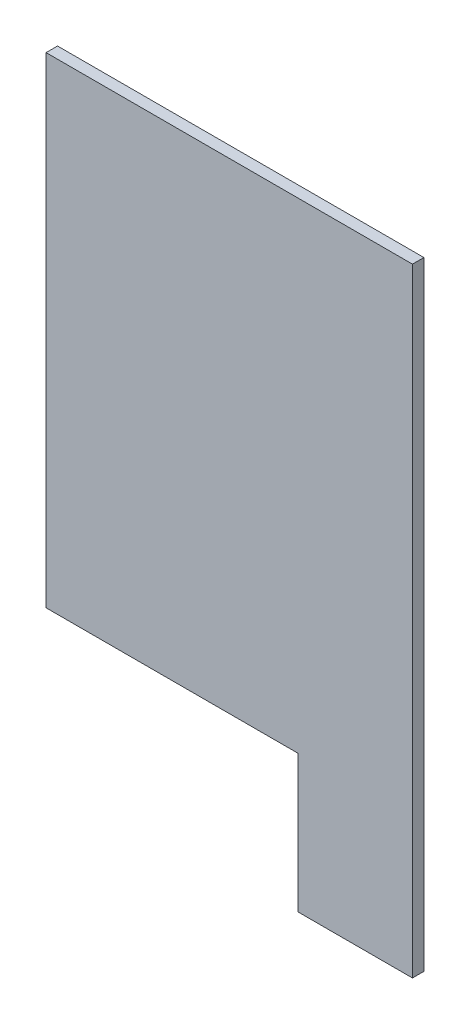
ISO-10303-21;
HEADER;
FILE_DESCRIPTION(('STEP AP214'),'2;1');
FILE_NAME('part.step','',(''),(''),'','','');
FILE_SCHEMA(('AUTOMOTIVE_DESIGN { 1 0 10303 214 1 1 1 1 }'));
ENDSEC;
DATA;
#1=APPLICATION_CONTEXT('core data for automotive mechanical design processes');
#2=APPLICATION_PROTOCOL_DEFINITION('international standard','automotive_design',2000,#1);
#3=PRODUCT_CONTEXT('',#1,'mechanical');
#4=PRODUCT('Part','Part','',(#3));
#5=PRODUCT_RELATED_PRODUCT_CATEGORY('part','',(#4));
#6=PRODUCT_DEFINITION_FORMATION('','',#4);
#7=PRODUCT_DEFINITION_CONTEXT('part definition',#1,'design');
#8=PRODUCT_DEFINITION('design','',#6,#7);
#9=PRODUCT_DEFINITION_SHAPE('','',#8);
#10=(LENGTH_UNIT() NAMED_UNIT(*) SI_UNIT(.MILLI.,.METRE.));
#11=(NAMED_UNIT(*) PLANE_ANGLE_UNIT() SI_UNIT($,.RADIAN.));
#12=(NAMED_UNIT(*) SI_UNIT($,.STERADIAN.) SOLID_ANGLE_UNIT());
#13=UNCERTAINTY_MEASURE_WITH_UNIT(LENGTH_MEASURE(1.E-05),#10,'distance_accuracy_value','');
#14=(GEOMETRIC_REPRESENTATION_CONTEXT(3) GLOBAL_UNCERTAINTY_ASSIGNED_CONTEXT((#13)) GLOBAL_UNIT_ASSIGNED_CONTEXT((#10,
#11,#12)) REPRESENTATION_CONTEXT('',''));
#15=CARTESIAN_POINT('',(0.,0.,0.));
#16=DIRECTION('',(0.,0.,1.));
#17=DIRECTION('',(1.,0.,0.));
#18=AXIS2_PLACEMENT_3D('',#15,#16,#17);
#19=CARTESIAN_POINT('',(0.,0.,5.));
#20=DIRECTION('',(1.,0.,0.));
#21=DIRECTION('',(0.,1.,0.));
#22=AXIS2_PLACEMENT_3D('',#19,#20,#21);
#23=PLANE('',#22);
#24=DIRECTION('',(0.,-1.,0.));
#25=VECTOR('',#24,1.);
#26=CARTESIAN_POINT('',(0.,0.,0.));
#27=LINE('',#26,#25);
#28=CARTESIAN_POINT('',(0.,0.,0.));
#29=VERTEX_POINT('',#28);
#30=CARTESIAN_POINT('',(0.,-210.,0.));
#31=VERTEX_POINT('',#30);
#32=EDGE_CURVE('E128',#29,#31,#27,.T.);
#33=ORIENTED_EDGE('',*,*,#32,.T.);
#34=DIRECTION('',(0.,0.,-1.));
#35=VECTOR('',#34,1.);
#36=CARTESIAN_POINT('',(0.,-210.,5.));
#37=LINE('',#36,#35);
#38=CARTESIAN_POINT('',(0.,-210.,5.));
#39=VERTEX_POINT('',#38);
#40=EDGE_CURVE('E11',#39,#31,#37,.T.);
#41=ORIENTED_EDGE('',*,*,#40,.F.);
#42=DIRECTION('',(0.,-1.,0.));
#43=VECTOR('',#42,1.);
#44=CARTESIAN_POINT('',(0.,0.,5.));
#45=LINE('',#44,#43);
#46=CARTESIAN_POINT('',(0.,0.,5.));
#47=VERTEX_POINT('',#46);
#48=EDGE_CURVE('E144',#47,#39,#45,.T.);
#49=ORIENTED_EDGE('',*,*,#48,.F.);
#50=DIRECTION('',(0.,0.,-1.));
#51=VECTOR('',#50,1.);
#52=CARTESIAN_POINT('',(0.,0.,5.));
#53=LINE('',#52,#51);
#54=EDGE_CURVE('E124',#47,#29,#53,.T.);
#55=ORIENTED_EDGE('',*,*,#54,.T.);
#56=EDGE_LOOP('',(#33,#41,#49,#55));
#57=FACE_BOUND('',#56,.T.);
#58=ADVANCED_FACE('F39',(#57),#23,.F.);
#59=CARTESIAN_POINT('',(0.,-210.,5.));
#60=DIRECTION('',(0.,1.,0.));
#61=DIRECTION('',(0.,0.,1.));
#62=AXIS2_PLACEMENT_3D('',#59,#60,#61);
#63=PLANE('',#62);
#64=DIRECTION('',(1.,0.,0.));
#65=VECTOR('',#64,1.);
#66=CARTESIAN_POINT('',(0.,-210.,0.));
#67=LINE('',#66,#65);
#68=CARTESIAN_POINT('',(110.,-210.,0.));
#69=VERTEX_POINT('',#68);
#70=EDGE_CURVE('E132',#31,#69,#67,.T.);
#71=ORIENTED_EDGE('',*,*,#70,.T.);
#72=DIRECTION('',(0.,0.,-1.));
#73=VECTOR('',#72,1.);
#74=CARTESIAN_POINT('',(110.,-210.,5.));
#75=LINE('',#74,#73);
#76=CARTESIAN_POINT('',(110.,-210.,5.));
#77=VERTEX_POINT('',#76);
#78=EDGE_CURVE('E48',#77,#69,#75,.T.);
#79=ORIENTED_EDGE('',*,*,#78,.F.);
#80=DIRECTION('',(1.,0.,0.));
#81=VECTOR('',#80,1.);
#82=CARTESIAN_POINT('',(0.,-210.,5.));
#83=LINE('',#82,#81);
#84=EDGE_CURVE('E93',#39,#77,#83,.T.);
#85=ORIENTED_EDGE('',*,*,#84,.F.);
#86=ORIENTED_EDGE('',*,*,#40,.T.);
#87=EDGE_LOOP('',(#71,#79,#85,#86));
#88=FACE_BOUND('',#87,.T.);
#89=ADVANCED_FACE('F172',(#88),#63,.F.);
#90=CARTESIAN_POINT('',(110.,-210.,5.));
#91=DIRECTION('',(1.,0.,0.));
#92=DIRECTION('',(0.,1.,0.));
#93=AXIS2_PLACEMENT_3D('',#90,#91,#92);
#94=PLANE('',#93);
#95=DIRECTION('',(0.,-1.,0.));
#96=VECTOR('',#95,1.);
#97=CARTESIAN_POINT('',(110.,-210.,0.));
#98=LINE('',#97,#96);
#99=CARTESIAN_POINT('',(110.,-270.,0.));
#100=VERTEX_POINT('',#99);
#101=EDGE_CURVE('E135',#69,#100,#98,.T.);
#102=ORIENTED_EDGE('',*,*,#101,.T.);
#103=DIRECTION('',(0.,0.,-1.));
#104=VECTOR('',#103,1.);
#105=CARTESIAN_POINT('',(110.,-270.,5.));
#106=LINE('',#105,#104);
#107=CARTESIAN_POINT('',(110.,-270.,5.));
#108=VERTEX_POINT('',#107);
#109=EDGE_CURVE('E117',#108,#100,#106,.T.);
#110=ORIENTED_EDGE('',*,*,#109,.F.);
#111=DIRECTION('',(0.,-1.,0.));
#112=VECTOR('',#111,1.);
#113=CARTESIAN_POINT('',(110.,-210.,5.));
#114=LINE('',#113,#112);
#115=EDGE_CURVE('E106',#77,#108,#114,.T.);
#116=ORIENTED_EDGE('',*,*,#115,.F.);
#117=ORIENTED_EDGE('',*,*,#78,.T.);
#118=EDGE_LOOP('',(#102,#110,#116,#117));
#119=FACE_BOUND('',#118,.T.);
#120=ADVANCED_FACE('F154',(#119),#94,.F.);
#121=CARTESIAN_POINT('',(110.,-270.,5.));
#122=DIRECTION('',(0.,1.,0.));
#123=DIRECTION('',(0.,0.,1.));
#124=AXIS2_PLACEMENT_3D('',#121,#122,#123);
#125=PLANE('',#124);
#126=DIRECTION('',(1.,0.,0.));
#127=VECTOR('',#126,1.);
#128=CARTESIAN_POINT('',(110.,-270.,0.));
#129=LINE('',#128,#127);
#130=CARTESIAN_POINT('',(160.,-270.,0.));
#131=VERTEX_POINT('',#130);
#132=EDGE_CURVE('E115',#100,#131,#129,.T.);
#133=ORIENTED_EDGE('',*,*,#132,.T.);
#134=DIRECTION('',(0.,0.,-1.));
#135=VECTOR('',#134,1.);
#136=CARTESIAN_POINT('',(160.,-270.,5.));
#137=LINE('',#136,#135);
#138=CARTESIAN_POINT('',(160.,-270.,5.));
#139=VERTEX_POINT('',#138);
#140=EDGE_CURVE('E112',#139,#131,#137,.T.);
#141=ORIENTED_EDGE('',*,*,#140,.F.);
#142=DIRECTION('',(1.,0.,0.));
#143=VECTOR('',#142,1.);
#144=CARTESIAN_POINT('',(110.,-270.,5.));
#145=LINE('',#144,#143);
#146=EDGE_CURVE('E100',#108,#139,#145,.T.);
#147=ORIENTED_EDGE('',*,*,#146,.F.);
#148=ORIENTED_EDGE('',*,*,#109,.T.);
#149=EDGE_LOOP('',(#133,#141,#147,#148));
#150=FACE_BOUND('',#149,.T.);
#151=ADVANCED_FACE('F113',(#150),#125,.F.);
#152=CARTESIAN_POINT('',(160.,0.,5.));
#153=DIRECTION('',(-1.,0.,0.));
#154=DIRECTION('',(0.,0.,1.));
#155=AXIS2_PLACEMENT_3D('',#152,#153,#154);
#156=PLANE('',#155);
#157=DIRECTION('',(0.,1.,0.));
#158=VECTOR('',#157,1.);
#159=CARTESIAN_POINT('',(160.,0.,0.));
#160=LINE('',#159,#158);
#161=CARTESIAN_POINT('',(160.,0.,0.));
#162=VERTEX_POINT('',#161);
#163=EDGE_CURVE('E79',#131,#162,#160,.T.);
#164=ORIENTED_EDGE('',*,*,#163,.T.);
#165=DIRECTION('',(0.,0.,-1.));
#166=VECTOR('',#165,1.);
#167=CARTESIAN_POINT('',(160.,0.,5.));
#168=LINE('',#167,#166);
#169=CARTESIAN_POINT('',(160.,0.,5.));
#170=VERTEX_POINT('',#169);
#171=EDGE_CURVE('E118',#170,#162,#168,.T.);
#172=ORIENTED_EDGE('',*,*,#171,.F.);
#173=DIRECTION('',(0.,1.,0.));
#174=VECTOR('',#173,1.);
#175=CARTESIAN_POINT('',(160.,0.,5.));
#176=LINE('',#175,#174);
#177=EDGE_CURVE('E104',#139,#170,#176,.T.);
#178=ORIENTED_EDGE('',*,*,#177,.F.);
#179=ORIENTED_EDGE('',*,*,#140,.T.);
#180=EDGE_LOOP('',(#164,#172,#178,#179));
#181=FACE_BOUND('',#180,.T.);
#182=ADVANCED_FACE('F120',(#181),#156,.F.);
#183=CARTESIAN_POINT('',(0.,0.,5.));
#184=DIRECTION('',(0.,-1.,0.));
#185=DIRECTION('',(0.,0.,-1.));
#186=AXIS2_PLACEMENT_3D('',#183,#184,#185);
#187=PLANE('',#186);
#188=DIRECTION('',(-1.,0.,0.));
#189=VECTOR('',#188,1.);
#190=CARTESIAN_POINT('',(0.,0.,0.));
#191=LINE('',#190,#189);
#192=EDGE_CURVE('E85',#162,#29,#191,.T.);
#193=ORIENTED_EDGE('',*,*,#192,.T.);
#194=ORIENTED_EDGE('',*,*,#54,.F.);
#195=DIRECTION('',(-1.,0.,0.));
#196=VECTOR('',#195,1.);
#197=CARTESIAN_POINT('',(0.,0.,5.));
#198=LINE('',#197,#196);
#199=EDGE_CURVE('E56',#170,#47,#198,.T.);
#200=ORIENTED_EDGE('',*,*,#199,.F.);
#201=ORIENTED_EDGE('',*,*,#171,.T.);
#202=EDGE_LOOP('',(#193,#194,#200,#201));
#203=FACE_BOUND('',#202,.T.);
#204=ADVANCED_FACE('F161',(#203),#187,.F.);
#205=CARTESIAN_POINT('',(0.,0.,5.));
#206=DIRECTION('',(0.,0.,1.));
#207=DIRECTION('',(1.,0.,0.));
#208=AXIS2_PLACEMENT_3D('',#205,#206,#207);
#209=PLANE('',#208);
#210=ORIENTED_EDGE('',*,*,#48,.T.);
#211=ORIENTED_EDGE('',*,*,#84,.T.);
#212=ORIENTED_EDGE('',*,*,#115,.T.);
#213=ORIENTED_EDGE('',*,*,#146,.T.);
#214=ORIENTED_EDGE('',*,*,#177,.T.);
#215=ORIENTED_EDGE('',*,*,#199,.T.);
#216=EDGE_LOOP('',(#210,#211,#212,#213,#214,#215));
#217=FACE_BOUND('',#216,.T.);
#218=ADVANCED_FACE('F102',(#217),#209,.T.);
#219=CARTESIAN_POINT('',(0.,0.,0.));
#220=DIRECTION('',(0.,0.,1.));
#221=DIRECTION('',(1.,0.,0.));
#222=AXIS2_PLACEMENT_3D('',#219,#220,#221);
#223=PLANE('',#222);
#224=ORIENTED_EDGE('',*,*,#32,.F.);
#225=ORIENTED_EDGE('',*,*,#192,.F.);
#226=ORIENTED_EDGE('',*,*,#163,.F.);
#227=ORIENTED_EDGE('',*,*,#132,.F.);
#228=ORIENTED_EDGE('',*,*,#101,.F.);
#229=ORIENTED_EDGE('',*,*,#70,.F.);
#230=EDGE_LOOP('',(#224,#225,#226,#227,#228,#229));
#231=FACE_BOUND('',#230,.T.);
#232=ADVANCED_FACE('F157',(#231),#223,.F.);
#233=CLOSED_SHELL('',(#58,#89,#120,#151,#182,#204,#218,#232));
#234=MANIFOLD_SOLID_BREP('B2',#233);
#235=ADVANCED_BREP_SHAPE_REPRESENTATION('',(#18,#234),#14);
#236=SHAPE_DEFINITION_REPRESENTATION(#9,#235);
ENDSEC;
END-ISO-10303-21;
